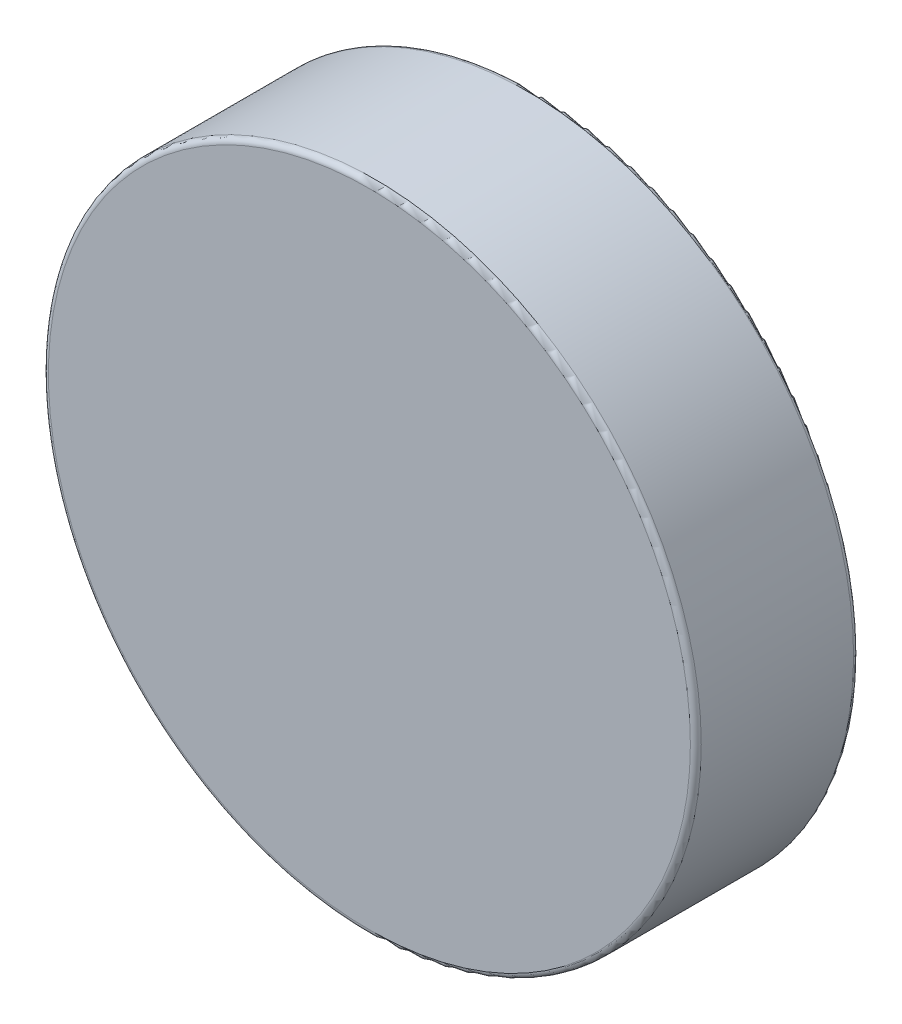
ISO-10303-21;
HEADER;
FILE_DESCRIPTION(('STEP AP214'),'2;1');
FILE_NAME('part.step','',(''),(''),'','','');
FILE_SCHEMA(('AUTOMOTIVE_DESIGN { 1 0 10303 214 1 1 1 1 }'));
ENDSEC;
DATA;
#1=APPLICATION_CONTEXT('core data for automotive mechanical design processes');
#2=APPLICATION_PROTOCOL_DEFINITION('international standard','automotive_design',2000,#1);
#3=PRODUCT_CONTEXT('',#1,'mechanical');
#4=PRODUCT('Part','Part','',(#3));
#5=PRODUCT_RELATED_PRODUCT_CATEGORY('part','',(#4));
#6=PRODUCT_DEFINITION_FORMATION('','',#4);
#7=PRODUCT_DEFINITION_CONTEXT('part definition',#1,'design');
#8=PRODUCT_DEFINITION('design','',#6,#7);
#9=PRODUCT_DEFINITION_SHAPE('','',#8);
#10=(LENGTH_UNIT() NAMED_UNIT(*) SI_UNIT(.MILLI.,.METRE.));
#11=(NAMED_UNIT(*) PLANE_ANGLE_UNIT() SI_UNIT($,.RADIAN.));
#12=(NAMED_UNIT(*) SI_UNIT($,.STERADIAN.) SOLID_ANGLE_UNIT());
#13=UNCERTAINTY_MEASURE_WITH_UNIT(LENGTH_MEASURE(1.E-05),#10,'distance_accuracy_value','');
#14=(GEOMETRIC_REPRESENTATION_CONTEXT(3) GLOBAL_UNCERTAINTY_ASSIGNED_CONTEXT((#13)) GLOBAL_UNIT_ASSIGNED_CONTEXT((#10,
#11,#12)) REPRESENTATION_CONTEXT('',''));
#15=CARTESIAN_POINT('',(0.,0.,0.));
#16=DIRECTION('',(0.,0.,1.));
#17=DIRECTION('',(1.,0.,0.));
#18=AXIS2_PLACEMENT_3D('',#15,#16,#17);
#19=CARTESIAN_POINT('',(0.,0.,7.5));
#20=DIRECTION('',(0.,0.,-1.));
#21=DIRECTION('',(-1.,0.,0.));
#22=AXIS2_PLACEMENT_3D('',#19,#20,#21);
#23=CYLINDRICAL_SURFACE('',#22,30.);
#24=CARTESIAN_POINT('',(0.,0.,-7.));
#25=DIRECTION('',(0.,0.,1.));
#26=DIRECTION('',(1.,0.,0.));
#27=AXIS2_PLACEMENT_3D('',#24,#25,#26);
#28=CIRCLE('',#27,30.);
#29=CARTESIAN_POINT('',(30.,0.,-7.));
#30=VERTEX_POINT('',#29);
#31=EDGE_CURVE('E46',#30,#30,#28,.T.);
#32=ORIENTED_EDGE('',*,*,#31,.T.);
#33=EDGE_LOOP('',(#32));
#34=FACE_BOUND('',#33,.T.);
#35=CARTESIAN_POINT('',(0.,0.,7.));
#36=DIRECTION('',(0.,0.,1.));
#37=DIRECTION('',(1.,0.,0.));
#38=AXIS2_PLACEMENT_3D('',#35,#36,#37);
#39=CIRCLE('',#38,30.);
#40=CARTESIAN_POINT('',(30.,0.,7.));
#41=VERTEX_POINT('',#40);
#42=EDGE_CURVE('E50',#41,#41,#39,.F.);
#43=ORIENTED_EDGE('',*,*,#42,.T.);
#44=EDGE_LOOP('',(#43));
#45=FACE_BOUND('',#44,.T.);
#46=ADVANCED_FACE('F35',(#34,#45),#23,.T.);
#47=CARTESIAN_POINT('',(0.,0.,7.5));
#48=DIRECTION('',(0.,0.,1.));
#49=DIRECTION('',(1.,0.,0.));
#50=AXIS2_PLACEMENT_3D('',#47,#48,#49);
#51=PLANE('',#50);
#52=CARTESIAN_POINT('',(0.,0.,7.5));
#53=DIRECTION('',(0.,0.,1.));
#54=DIRECTION('',(1.,0.,0.));
#55=AXIS2_PLACEMENT_3D('',#52,#53,#54);
#56=CIRCLE('',#55,29.5);
#57=CARTESIAN_POINT('',(29.5,0.,7.5));
#58=VERTEX_POINT('',#57);
#59=EDGE_CURVE('E10',#58,#58,#56,.T.);
#60=ORIENTED_EDGE('',*,*,#59,.T.);
#61=EDGE_LOOP('',(#60));
#62=FACE_BOUND('',#61,.T.);
#63=ADVANCED_FACE('F66',(#62),#51,.T.);
#64=CARTESIAN_POINT('',(0.,0.,-7.5));
#65=DIRECTION('',(0.,0.,1.));
#66=DIRECTION('',(1.,0.,0.));
#67=AXIS2_PLACEMENT_3D('',#64,#65,#66);
#68=PLANE('',#67);
#69=CARTESIAN_POINT('',(0.,0.,-7.5));
#70=DIRECTION('',(0.,0.,1.));
#71=DIRECTION('',(1.,0.,0.));
#72=AXIS2_PLACEMENT_3D('',#69,#70,#71);
#73=CIRCLE('',#72,29.5);
#74=CARTESIAN_POINT('',(29.5,0.,-7.5));
#75=VERTEX_POINT('',#74);
#76=EDGE_CURVE('E42',#75,#75,#73,.F.);
#77=ORIENTED_EDGE('',*,*,#76,.T.);
#78=EDGE_LOOP('',(#77));
#79=FACE_BOUND('',#78,.T.);
#80=ADVANCED_FACE('F63',(#79),#68,.F.);
#81=CARTESIAN_POINT('',(0.,0.,-7.));
#82=DIRECTION('',(0.,0.,1.));
#83=DIRECTION('',(1.,0.,0.));
#84=AXIS2_PLACEMENT_3D('',#81,#82,#83);
#85=TOROIDAL_SURFACE('',#84,29.5,0.5);
#86=ORIENTED_EDGE('',*,*,#76,.F.);
#87=EDGE_LOOP('',(#86));
#88=FACE_BOUND('',#87,.T.);
#89=ORIENTED_EDGE('',*,*,#31,.F.);
#90=EDGE_LOOP('',(#89));
#91=FACE_BOUND('',#90,.T.);
#92=ADVANCED_FACE('F59',(#88,#91),#85,.T.);
#93=CARTESIAN_POINT('',(0.,0.,7.));
#94=DIRECTION('',(0.,0.,1.));
#95=DIRECTION('',(1.,0.,0.));
#96=AXIS2_PLACEMENT_3D('',#93,#94,#95);
#97=TOROIDAL_SURFACE('',#96,29.5,0.5);
#98=ORIENTED_EDGE('',*,*,#42,.F.);
#99=EDGE_LOOP('',(#98));
#100=FACE_BOUND('',#99,.T.);
#101=ORIENTED_EDGE('',*,*,#59,.F.);
#102=EDGE_LOOP('',(#101));
#103=FACE_BOUND('',#102,.T.);
#104=ADVANCED_FACE('F37',(#100,#103),#97,.T.);
#105=CLOSED_SHELL('',(#46,#63,#80,#92,#104));
#106=MANIFOLD_SOLID_BREP('B2',#105);
#107=ADVANCED_BREP_SHAPE_REPRESENTATION('',(#18,#106),#14);
#108=SHAPE_DEFINITION_REPRESENTATION(#9,#107);
ENDSEC;
END-ISO-10303-21;
